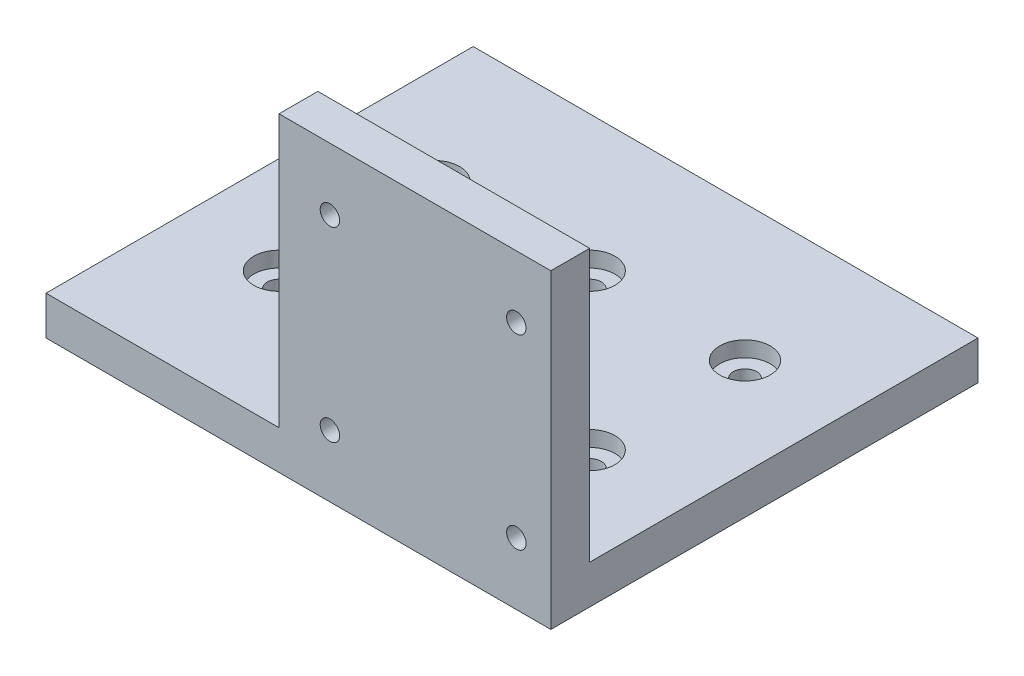
ISO-10303-21;
HEADER;
FILE_DESCRIPTION(('STEP AP214'),'2;1');
FILE_NAME('part.step','',(''),(''),'','','');
FILE_SCHEMA(('AUTOMOTIVE_DESIGN { 1 0 10303 214 1 1 1 1 }'));
ENDSEC;
DATA;
#1=APPLICATION_CONTEXT('core data for automotive mechanical design processes');
#2=APPLICATION_PROTOCOL_DEFINITION('international standard','automotive_design',2000,#1);
#3=PRODUCT_CONTEXT('',#1,'mechanical');
#4=PRODUCT('Part','Part','',(#3));
#5=PRODUCT_RELATED_PRODUCT_CATEGORY('part','',(#4));
#6=PRODUCT_DEFINITION_FORMATION('','',#4);
#7=PRODUCT_DEFINITION_CONTEXT('part definition',#1,'design');
#8=PRODUCT_DEFINITION('design','',#6,#7);
#9=PRODUCT_DEFINITION_SHAPE('','',#8);
#10=(LENGTH_UNIT() NAMED_UNIT(*) SI_UNIT(.MILLI.,.METRE.));
#11=(NAMED_UNIT(*) PLANE_ANGLE_UNIT() SI_UNIT($,.RADIAN.));
#12=(NAMED_UNIT(*) SI_UNIT($,.STERADIAN.) SOLID_ANGLE_UNIT());
#13=UNCERTAINTY_MEASURE_WITH_UNIT(LENGTH_MEASURE(1.E-05),#10,'distance_accuracy_value','');
#14=(GEOMETRIC_REPRESENTATION_CONTEXT(3) GLOBAL_UNCERTAINTY_ASSIGNED_CONTEXT((#13)) GLOBAL_UNIT_ASSIGNED_CONTEXT((#10,
#11,#12)) REPRESENTATION_CONTEXT('',''));
#15=CARTESIAN_POINT('',(0.,0.,0.));
#16=DIRECTION('',(0.,0.,1.));
#17=DIRECTION('',(1.,0.,0.));
#18=AXIS2_PLACEMENT_3D('',#15,#16,#17);
#19=CARTESIAN_POINT('',(0.,0.,10.));
#20=DIRECTION('',(0.,1.,0.));
#21=DIRECTION('',(0.,0.,1.));
#22=AXIS2_PLACEMENT_3D('',#19,#20,#21);
#23=CYLINDRICAL_SURFACE('',#22,1.5);
#24=CARTESIAN_POINT('',(0.,0.,10.));
#25=DIRECTION('',(0.,1.,0.));
#26=DIRECTION('',(0.,0.,1.));
#27=AXIS2_PLACEMENT_3D('',#24,#25,#26);
#28=CIRCLE('',#27,1.5);
#29=CARTESIAN_POINT('',(0.,0.,11.5));
#30=VERTEX_POINT('',#29);
#31=EDGE_CURVE('E212',#30,#30,#28,.T.);
#32=ORIENTED_EDGE('',*,*,#31,.F.);
#33=EDGE_LOOP('',(#32));
#34=FACE_BOUND('',#33,.T.);
#35=CARTESIAN_POINT('',(0.,3.,10.));
#36=DIRECTION('',(0.,1.,0.));
#37=DIRECTION('',(0.,0.,1.));
#38=AXIS2_PLACEMENT_3D('',#35,#36,#37);
#39=CIRCLE('',#38,1.5);
#40=CARTESIAN_POINT('',(0.,3.,11.5));
#41=VERTEX_POINT('',#40);
#42=EDGE_CURVE('E211',#41,#41,#39,.F.);
#43=ORIENTED_EDGE('',*,*,#42,.F.);
#44=EDGE_LOOP('',(#43));
#45=FACE_BOUND('',#44,.T.);
#46=ADVANCED_FACE('F46',(#34,#45),#23,.F.);
#47=CARTESIAN_POINT('',(20.,0.,10.));
#48=DIRECTION('',(0.,1.,0.));
#49=DIRECTION('',(0.,0.,1.));
#50=AXIS2_PLACEMENT_3D('',#47,#48,#49);
#51=CYLINDRICAL_SURFACE('',#50,1.5);
#52=CARTESIAN_POINT('',(20.,0.,10.));
#53=DIRECTION('',(0.,1.,0.));
#54=DIRECTION('',(0.,0.,1.));
#55=AXIS2_PLACEMENT_3D('',#52,#53,#54);
#56=CIRCLE('',#55,1.5);
#57=CARTESIAN_POINT('',(20.,0.,11.5));
#58=VERTEX_POINT('',#57);
#59=EDGE_CURVE('E216',#58,#58,#56,.T.);
#60=ORIENTED_EDGE('',*,*,#59,.F.);
#61=EDGE_LOOP('',(#60));
#62=FACE_BOUND('',#61,.T.);
#63=CARTESIAN_POINT('',(20.,3.,10.));
#64=DIRECTION('',(0.,1.,0.));
#65=DIRECTION('',(0.,0.,1.));
#66=AXIS2_PLACEMENT_3D('',#63,#64,#65);
#67=CIRCLE('',#66,1.5);
#68=CARTESIAN_POINT('',(20.,3.,11.5));
#69=VERTEX_POINT('',#68);
#70=EDGE_CURVE('E280',#69,#69,#67,.F.);
#71=ORIENTED_EDGE('',*,*,#70,.F.);
#72=EDGE_LOOP('',(#71));
#73=FACE_BOUND('',#72,.T.);
#74=ADVANCED_FACE('F335',(#62,#73),#51,.F.);
#75=CARTESIAN_POINT('',(-20.,0.,10.));
#76=DIRECTION('',(0.,1.,0.));
#77=DIRECTION('',(0.,0.,1.));
#78=AXIS2_PLACEMENT_3D('',#75,#76,#77);
#79=CYLINDRICAL_SURFACE('',#78,1.5);
#80=CARTESIAN_POINT('',(-20.,0.,10.));
#81=DIRECTION('',(0.,1.,0.));
#82=DIRECTION('',(0.,0.,1.));
#83=AXIS2_PLACEMENT_3D('',#80,#81,#82);
#84=CIRCLE('',#83,1.5);
#85=CARTESIAN_POINT('',(-20.,0.,11.5));
#86=VERTEX_POINT('',#85);
#87=EDGE_CURVE('E226',#86,#86,#84,.T.);
#88=ORIENTED_EDGE('',*,*,#87,.F.);
#89=EDGE_LOOP('',(#88));
#90=FACE_BOUND('',#89,.T.);
#91=CARTESIAN_POINT('',(-20.,3.,10.));
#92=DIRECTION('',(0.,1.,0.));
#93=DIRECTION('',(0.,0.,1.));
#94=AXIS2_PLACEMENT_3D('',#91,#92,#93);
#95=CIRCLE('',#94,1.5);
#96=CARTESIAN_POINT('',(-20.,3.,11.5));
#97=VERTEX_POINT('',#96);
#98=EDGE_CURVE('E276',#97,#97,#95,.F.);
#99=ORIENTED_EDGE('',*,*,#98,.F.);
#100=EDGE_LOOP('',(#99));
#101=FACE_BOUND('',#100,.T.);
#102=ADVANCED_FACE('F341',(#90,#101),#79,.F.);
#103=CARTESIAN_POINT('',(20.,0.,-9.99999999999999));
#104=DIRECTION('',(0.,1.,0.));
#105=DIRECTION('',(0.,0.,1.));
#106=AXIS2_PLACEMENT_3D('',#103,#104,#105);
#107=CYLINDRICAL_SURFACE('',#106,1.5);
#108=CARTESIAN_POINT('',(20.,0.,-9.99999999999999));
#109=DIRECTION('',(0.,1.,0.));
#110=DIRECTION('',(0.,0.,1.));
#111=AXIS2_PLACEMENT_3D('',#108,#109,#110);
#112=CIRCLE('',#111,1.5);
#113=CARTESIAN_POINT('',(20.,0.,-8.49999999999999));
#114=VERTEX_POINT('',#113);
#115=EDGE_CURVE('E222',#114,#114,#112,.T.);
#116=ORIENTED_EDGE('',*,*,#115,.F.);
#117=EDGE_LOOP('',(#116));
#118=FACE_BOUND('',#117,.T.);
#119=CARTESIAN_POINT('',(20.,3.,-9.99999999999999));
#120=DIRECTION('',(0.,1.,0.));
#121=DIRECTION('',(0.,0.,1.));
#122=AXIS2_PLACEMENT_3D('',#119,#120,#121);
#123=CIRCLE('',#122,1.5);
#124=CARTESIAN_POINT('',(20.,3.,-8.49999999999999));
#125=VERTEX_POINT('',#124);
#126=EDGE_CURVE('E272',#125,#125,#123,.F.);
#127=ORIENTED_EDGE('',*,*,#126,.F.);
#128=EDGE_LOOP('',(#127));
#129=FACE_BOUND('',#128,.T.);
#130=ADVANCED_FACE('F354',(#118,#129),#107,.F.);
#131=CARTESIAN_POINT('',(0.,0.,-9.99999999999999));
#132=DIRECTION('',(0.,1.,0.));
#133=DIRECTION('',(0.,0.,1.));
#134=AXIS2_PLACEMENT_3D('',#131,#132,#133);
#135=CYLINDRICAL_SURFACE('',#134,1.5);
#136=CARTESIAN_POINT('',(0.,0.,-9.99999999999999));
#137=DIRECTION('',(0.,1.,0.));
#138=DIRECTION('',(0.,0.,1.));
#139=AXIS2_PLACEMENT_3D('',#136,#137,#138);
#140=CIRCLE('',#139,1.5);
#141=CARTESIAN_POINT('',(0.,0.,-8.49999999999999));
#142=VERTEX_POINT('',#141);
#143=EDGE_CURVE('E217',#142,#142,#140,.T.);
#144=ORIENTED_EDGE('',*,*,#143,.F.);
#145=EDGE_LOOP('',(#144));
#146=FACE_BOUND('',#145,.T.);
#147=CARTESIAN_POINT('',(0.,3.,-9.99999999999999));
#148=DIRECTION('',(0.,1.,0.));
#149=DIRECTION('',(0.,0.,1.));
#150=AXIS2_PLACEMENT_3D('',#147,#148,#149);
#151=CIRCLE('',#150,1.5);
#152=CARTESIAN_POINT('',(0.,3.,-8.49999999999999));
#153=VERTEX_POINT('',#152);
#154=EDGE_CURVE('E198',#153,#153,#151,.F.);
#155=ORIENTED_EDGE('',*,*,#154,.F.);
#156=EDGE_LOOP('',(#155));
#157=FACE_BOUND('',#156,.T.);
#158=ADVANCED_FACE('F350',(#146,#157),#135,.F.);
#159=CARTESIAN_POINT('',(-20.,0.,-10.));
#160=DIRECTION('',(0.,1.,0.));
#161=DIRECTION('',(0.,0.,1.));
#162=AXIS2_PLACEMENT_3D('',#159,#160,#161);
#163=CYLINDRICAL_SURFACE('',#162,1.5);
#164=CARTESIAN_POINT('',(-20.,0.,-10.));
#165=DIRECTION('',(0.,1.,0.));
#166=DIRECTION('',(0.,0.,1.));
#167=AXIS2_PLACEMENT_3D('',#164,#165,#166);
#168=CIRCLE('',#167,1.5);
#169=CARTESIAN_POINT('',(-20.,0.,-8.5));
#170=VERTEX_POINT('',#169);
#171=EDGE_CURVE('E221',#170,#170,#168,.T.);
#172=ORIENTED_EDGE('',*,*,#171,.F.);
#173=EDGE_LOOP('',(#172));
#174=FACE_BOUND('',#173,.T.);
#175=CARTESIAN_POINT('',(-20.,3.,-10.));
#176=DIRECTION('',(0.,1.,0.));
#177=DIRECTION('',(0.,0.,1.));
#178=AXIS2_PLACEMENT_3D('',#175,#176,#177);
#179=CIRCLE('',#178,1.5);
#180=CARTESIAN_POINT('',(-20.,3.,-8.5));
#181=VERTEX_POINT('',#180);
#182=EDGE_CURVE('E206',#181,#181,#179,.F.);
#183=ORIENTED_EDGE('',*,*,#182,.F.);
#184=EDGE_LOOP('',(#183));
#185=FACE_BOUND('',#184,.T.);
#186=ADVANCED_FACE('F353',(#174,#185),#163,.F.);
#187=CARTESIAN_POINT('',(32.5,5.,27.5));
#188=DIRECTION('',(-1.,0.,0.));
#189=DIRECTION('',(0.,0.,1.));
#190=AXIS2_PLACEMENT_3D('',#187,#188,#189);
#191=PLANE('',#190);
#192=DIRECTION('',(0.,0.,-1.));
#193=VECTOR('',#192,1.);
#194=CARTESIAN_POINT('',(32.5,0.,27.5));
#195=LINE('',#194,#193);
#196=CARTESIAN_POINT('',(32.5,0.,27.5));
#197=VERTEX_POINT('',#196);
#198=CARTESIAN_POINT('',(32.5,0.,-27.5));
#199=VERTEX_POINT('',#198);
#200=EDGE_CURVE('E236',#197,#199,#195,.T.);
#201=ORIENTED_EDGE('',*,*,#200,.T.);
#202=DIRECTION('',(0.,-1.,0.));
#203=VECTOR('',#202,1.);
#204=CARTESIAN_POINT('',(32.5,5.,-27.5));
#205=LINE('',#204,#203);
#206=CARTESIAN_POINT('',(32.5,5.,-27.5));
#207=VERTEX_POINT('',#206);
#208=EDGE_CURVE('E11',#207,#199,#205,.T.);
#209=ORIENTED_EDGE('',*,*,#208,.F.);
#210=DIRECTION('',(0.,0.,-1.));
#211=VECTOR('',#210,1.);
#212=CARTESIAN_POINT('',(32.5,5.,27.5));
#213=LINE('',#212,#211);
#214=CARTESIAN_POINT('',(32.5,5.,22.5));
#215=VERTEX_POINT('',#214);
#216=EDGE_CURVE('E98',#215,#207,#213,.T.);
#217=ORIENTED_EDGE('',*,*,#216,.F.);
#218=DIRECTION('',(0.,-1.,0.));
#219=VECTOR('',#218,1.);
#220=CARTESIAN_POINT('',(32.5,40.,22.5));
#221=LINE('',#220,#219);
#222=CARTESIAN_POINT('',(32.5,40.,22.5));
#223=VERTEX_POINT('',#222);
#224=EDGE_CURVE('E64',#223,#215,#221,.T.);
#225=ORIENTED_EDGE('',*,*,#224,.F.);
#226=DIRECTION('',(0.,0.,-1.));
#227=VECTOR('',#226,1.);
#228=CARTESIAN_POINT('',(32.5,40.,0.));
#229=LINE('',#228,#227);
#230=CARTESIAN_POINT('',(32.5,40.,27.5));
#231=VERTEX_POINT('',#230);
#232=EDGE_CURVE('E138',#231,#223,#229,.T.);
#233=ORIENTED_EDGE('',*,*,#232,.F.);
#234=DIRECTION('',(0.,-1.,0.));
#235=VECTOR('',#234,1.);
#236=CARTESIAN_POINT('',(32.5,5.,27.5));
#237=LINE('',#236,#235);
#238=EDGE_CURVE('E134',#231,#197,#237,.T.);
#239=ORIENTED_EDGE('',*,*,#238,.T.);
#240=EDGE_LOOP('',(#201,#209,#217,#225,#233,#239));
#241=FACE_BOUND('',#240,.T.);
#242=ADVANCED_FACE('F48',(#241),#191,.F.);
#243=CARTESIAN_POINT('',(-32.5,5.,-27.5));
#244=DIRECTION('',(0.,0.,1.));
#245=DIRECTION('',(1.,0.,0.));
#246=AXIS2_PLACEMENT_3D('',#243,#244,#245);
#247=PLANE('',#246);
#248=DIRECTION('',(-1.,0.,0.));
#249=VECTOR('',#248,1.);
#250=CARTESIAN_POINT('',(-32.5,0.,-27.5));
#251=LINE('',#250,#249);
#252=CARTESIAN_POINT('',(-32.5,0.,-27.5));
#253=VERTEX_POINT('',#252);
#254=EDGE_CURVE('E250',#199,#253,#251,.T.);
#255=ORIENTED_EDGE('',*,*,#254,.T.);
#256=DIRECTION('',(0.,-1.,0.));
#257=VECTOR('',#256,1.);
#258=CARTESIAN_POINT('',(-32.5,5.,-27.5));
#259=LINE('',#258,#257);
#260=CARTESIAN_POINT('',(-32.5,5.,-27.5));
#261=VERTEX_POINT('',#260);
#262=EDGE_CURVE('E56',#261,#253,#259,.T.);
#263=ORIENTED_EDGE('',*,*,#262,.F.);
#264=DIRECTION('',(-1.,0.,0.));
#265=VECTOR('',#264,1.);
#266=CARTESIAN_POINT('',(-32.5,5.,-27.5));
#267=LINE('',#266,#265);
#268=EDGE_CURVE('E239',#207,#261,#267,.T.);
#269=ORIENTED_EDGE('',*,*,#268,.F.);
#270=ORIENTED_EDGE('',*,*,#208,.T.);
#271=EDGE_LOOP('',(#255,#263,#269,#270));
#272=FACE_BOUND('',#271,.T.);
#273=ADVANCED_FACE('F323',(#272),#247,.F.);
#274=CARTESIAN_POINT('',(-32.5,5.,27.5));
#275=DIRECTION('',(1.,0.,0.));
#276=DIRECTION('',(0.,0.,-1.));
#277=AXIS2_PLACEMENT_3D('',#274,#275,#276);
#278=PLANE('',#277);
#279=DIRECTION('',(0.,0.,1.));
#280=VECTOR('',#279,1.);
#281=CARTESIAN_POINT('',(-32.5,0.,27.5));
#282=LINE('',#281,#280);
#283=CARTESIAN_POINT('',(-32.5,0.,27.5));
#284=VERTEX_POINT('',#283);
#285=EDGE_CURVE('E253',#253,#284,#282,.T.);
#286=ORIENTED_EDGE('',*,*,#285,.T.);
#287=DIRECTION('',(0.,-1.,0.));
#288=VECTOR('',#287,1.);
#289=CARTESIAN_POINT('',(-32.5,5.,27.5));
#290=LINE('',#289,#288);
#291=CARTESIAN_POINT('',(-32.5,5.,27.5));
#292=VERTEX_POINT('',#291);
#293=EDGE_CURVE('E260',#292,#284,#290,.T.);
#294=ORIENTED_EDGE('',*,*,#293,.F.);
#295=DIRECTION('',(0.,0.,1.));
#296=VECTOR('',#295,1.);
#297=CARTESIAN_POINT('',(-32.5,5.,27.5));
#298=LINE('',#297,#296);
#299=EDGE_CURVE('E73',#261,#292,#298,.T.);
#300=ORIENTED_EDGE('',*,*,#299,.F.);
#301=ORIENTED_EDGE('',*,*,#262,.T.);
#302=EDGE_LOOP('',(#286,#294,#300,#301));
#303=FACE_BOUND('',#302,.T.);
#304=ADVANCED_FACE('F325',(#303),#278,.F.);
#305=CARTESIAN_POINT('',(-32.5,5.,27.5));
#306=DIRECTION('',(0.,0.,-1.));
#307=DIRECTION('',(-1.,0.,0.));
#308=AXIS2_PLACEMENT_3D('',#305,#306,#307);
#309=PLANE('',#308);
#310=CARTESIAN_POINT('',(4.0553429013079,8.,27.5));
#311=DIRECTION('',(0.,0.,1.));
#312=DIRECTION('',(1.,0.,0.));
#313=AXIS2_PLACEMENT_3D('',#310,#311,#312);
#314=CIRCLE('',#313,1.25);
#315=CARTESIAN_POINT('',(5.3053429013079,8.,27.5));
#316=VERTEX_POINT('',#315);
#317=EDGE_CURVE('E720',#316,#316,#314,.T.);
#318=ORIENTED_EDGE('',*,*,#317,.F.);
#319=EDGE_LOOP('',(#318));
#320=FACE_BOUND('',#319,.T.);
#321=CARTESIAN_POINT('',(28.0553429013079,32.,27.5));
#322=DIRECTION('',(0.,0.,1.));
#323=DIRECTION('',(1.,0.,0.));
#324=AXIS2_PLACEMENT_3D('',#321,#322,#323);
#325=CIRCLE('',#324,1.25);
#326=CARTESIAN_POINT('',(29.3053429013079,32.,27.5));
#327=VERTEX_POINT('',#326);
#328=EDGE_CURVE('E717',#327,#327,#325,.T.);
#329=ORIENTED_EDGE('',*,*,#328,.F.);
#330=EDGE_LOOP('',(#329));
#331=FACE_BOUND('',#330,.T.);
#332=CARTESIAN_POINT('',(28.0553429013079,8.,27.5));
#333=DIRECTION('',(0.,0.,1.));
#334=DIRECTION('',(1.,0.,0.));
#335=AXIS2_PLACEMENT_3D('',#332,#333,#334);
#336=CIRCLE('',#335,1.25);
#337=CARTESIAN_POINT('',(29.3053429013079,8.,27.5));
#338=VERTEX_POINT('',#337);
#339=EDGE_CURVE('E721',#338,#338,#336,.T.);
#340=ORIENTED_EDGE('',*,*,#339,.F.);
#341=EDGE_LOOP('',(#340));
#342=FACE_BOUND('',#341,.T.);
#343=CARTESIAN_POINT('',(4.0553429013079,32.,27.5));
#344=DIRECTION('',(0.,0.,1.));
#345=DIRECTION('',(1.,0.,0.));
#346=AXIS2_PLACEMENT_3D('',#343,#344,#345);
#347=CIRCLE('',#346,1.25);
#348=CARTESIAN_POINT('',(5.3053429013079,32.,27.5));
#349=VERTEX_POINT('',#348);
#350=EDGE_CURVE('E148',#349,#349,#347,.T.);
#351=ORIENTED_EDGE('',*,*,#350,.F.);
#352=EDGE_LOOP('',(#351));
#353=FACE_BOUND('',#352,.T.);
#354=DIRECTION('',(1.,0.,0.));
#355=VECTOR('',#354,1.);
#356=CARTESIAN_POINT('',(-32.5,0.,27.5));
#357=LINE('',#356,#355);
#358=EDGE_CURVE('E94',#284,#197,#357,.T.);
#359=ORIENTED_EDGE('',*,*,#358,.T.);
#360=ORIENTED_EDGE('',*,*,#238,.F.);
#361=DIRECTION('',(1.,0.,0.));
#362=VECTOR('',#361,1.);
#363=CARTESIAN_POINT('',(0.,40.,27.5));
#364=LINE('',#363,#362);
#365=CARTESIAN_POINT('',(-2.5,40.,27.5));
#366=VERTEX_POINT('',#365);
#367=EDGE_CURVE('E132',#366,#231,#364,.T.);
#368=ORIENTED_EDGE('',*,*,#367,.F.);
#369=DIRECTION('',(0.,-1.,0.));
#370=VECTOR('',#369,1.);
#371=CARTESIAN_POINT('',(-2.5,40.,27.5));
#372=LINE('',#371,#370);
#373=CARTESIAN_POINT('',(-2.5,5.,27.5));
#374=VERTEX_POINT('',#373);
#375=EDGE_CURVE('E119',#366,#374,#372,.T.);
#376=ORIENTED_EDGE('',*,*,#375,.T.);
#377=DIRECTION('',(1.,0.,0.));
#378=VECTOR('',#377,1.);
#379=CARTESIAN_POINT('',(-32.5,5.,27.5));
#380=LINE('',#379,#378);
#381=EDGE_CURVE('E244',#292,#374,#380,.T.);
#382=ORIENTED_EDGE('',*,*,#381,.F.);
#383=ORIENTED_EDGE('',*,*,#293,.T.);
#384=EDGE_LOOP('',(#359,#360,#368,#376,#382,#383));
#385=FACE_BOUND('',#384,.T.);
#386=ADVANCED_FACE('F133',(#320,#331,#342,#353,#385),#309,.F.);
#387=CARTESIAN_POINT('',(0.,5.,0.));
#388=DIRECTION('',(0.,-1.,0.));
#389=DIRECTION('',(0.,0.,-1.));
#390=AXIS2_PLACEMENT_3D('',#387,#388,#389);
#391=PLANE('',#390);
#392=CARTESIAN_POINT('',(20.,5.,-10.));
#393=DIRECTION('',(0.,1.,0.));
#394=DIRECTION('',(0.,0.,1.));
#395=AXIS2_PLACEMENT_3D('',#392,#393,#394);
#396=CIRCLE('',#395,3.25);
#397=CARTESIAN_POINT('',(20.,5.,-6.75));
#398=VERTEX_POINT('',#397);
#399=EDGE_CURVE('E183',#398,#398,#396,.T.);
#400=ORIENTED_EDGE('',*,*,#399,.F.);
#401=EDGE_LOOP('',(#400));
#402=FACE_BOUND('',#401,.T.);
#403=CARTESIAN_POINT('',(-20.,5.,10.));
#404=DIRECTION('',(0.,1.,0.));
#405=DIRECTION('',(0.,0.,1.));
#406=AXIS2_PLACEMENT_3D('',#403,#404,#405);
#407=CIRCLE('',#406,3.25);
#408=CARTESIAN_POINT('',(-20.,5.,13.25));
#409=VERTEX_POINT('',#408);
#410=EDGE_CURVE('E166',#409,#409,#407,.T.);
#411=ORIENTED_EDGE('',*,*,#410,.F.);
#412=EDGE_LOOP('',(#411));
#413=FACE_BOUND('',#412,.T.);
#414=CARTESIAN_POINT('',(0.,5.,10.));
#415=DIRECTION('',(0.,1.,0.));
#416=DIRECTION('',(0.,0.,1.));
#417=AXIS2_PLACEMENT_3D('',#414,#415,#416);
#418=CIRCLE('',#417,3.25);
#419=CARTESIAN_POINT('',(0.,5.,13.25));
#420=VERTEX_POINT('',#419);
#421=EDGE_CURVE('E167',#420,#420,#418,.T.);
#422=ORIENTED_EDGE('',*,*,#421,.F.);
#423=EDGE_LOOP('',(#422));
#424=FACE_BOUND('',#423,.T.);
#425=CARTESIAN_POINT('',(20.,5.,10.));
#426=DIRECTION('',(0.,1.,0.));
#427=DIRECTION('',(0.,0.,1.));
#428=AXIS2_PLACEMENT_3D('',#425,#426,#427);
#429=CIRCLE('',#428,3.25);
#430=CARTESIAN_POINT('',(20.,5.,13.25));
#431=VERTEX_POINT('',#430);
#432=EDGE_CURVE('E129',#431,#431,#429,.T.);
#433=ORIENTED_EDGE('',*,*,#432,.F.);
#434=EDGE_LOOP('',(#433));
#435=FACE_BOUND('',#434,.T.);
#436=CARTESIAN_POINT('',(0.,5.,-10.));
#437=DIRECTION('',(0.,1.,0.));
#438=DIRECTION('',(0.,0.,1.));
#439=AXIS2_PLACEMENT_3D('',#436,#437,#438);
#440=CIRCLE('',#439,3.25);
#441=CARTESIAN_POINT('',(0.,5.,-6.75));
#442=VERTEX_POINT('',#441);
#443=EDGE_CURVE('E182',#442,#442,#440,.T.);
#444=ORIENTED_EDGE('',*,*,#443,.F.);
#445=EDGE_LOOP('',(#444));
#446=FACE_BOUND('',#445,.T.);
#447=CARTESIAN_POINT('',(-20.,5.,-10.));
#448=DIRECTION('',(0.,1.,0.));
#449=DIRECTION('',(0.,0.,1.));
#450=AXIS2_PLACEMENT_3D('',#447,#448,#449);
#451=CIRCLE('',#450,3.25);
#452=CARTESIAN_POINT('',(-20.,5.,-6.75));
#453=VERTEX_POINT('',#452);
#454=EDGE_CURVE('E207',#453,#453,#451,.T.);
#455=ORIENTED_EDGE('',*,*,#454,.F.);
#456=EDGE_LOOP('',(#455));
#457=FACE_BOUND('',#456,.T.);
#458=ORIENTED_EDGE('',*,*,#381,.T.);
#459=DIRECTION('',(0.,0.,-1.));
#460=VECTOR('',#459,1.);
#461=CARTESIAN_POINT('',(-2.5,5.,0.));
#462=LINE('',#461,#460);
#463=CARTESIAN_POINT('',(-2.5,5.,22.5));
#464=VERTEX_POINT('',#463);
#465=EDGE_CURVE('E126',#374,#464,#462,.T.);
#466=ORIENTED_EDGE('',*,*,#465,.T.);
#467=DIRECTION('',(1.,0.,0.));
#468=VECTOR('',#467,1.);
#469=CARTESIAN_POINT('',(0.,5.,22.5));
#470=LINE('',#469,#468);
#471=EDGE_CURVE('E143',#464,#215,#470,.T.);
#472=ORIENTED_EDGE('',*,*,#471,.T.);
#473=ORIENTED_EDGE('',*,*,#216,.T.);
#474=ORIENTED_EDGE('',*,*,#268,.T.);
#475=ORIENTED_EDGE('',*,*,#299,.T.);
#476=EDGE_LOOP('',(#458,#466,#472,#473,#474,#475));
#477=FACE_BOUND('',#476,.T.);
#478=ADVANCED_FACE('F314',(#402,#413,#424,#435,#446,#457,#477),#391,.F.);
#479=CARTESIAN_POINT('',(0.,0.,0.));
#480=DIRECTION('',(0.,-1.,0.));
#481=DIRECTION('',(0.,0.,-1.));
#482=AXIS2_PLACEMENT_3D('',#479,#480,#481);
#483=PLANE('',#482);
#484=ORIENTED_EDGE('',*,*,#143,.T.);
#485=EDGE_LOOP('',(#484));
#486=FACE_BOUND('',#485,.T.);
#487=ORIENTED_EDGE('',*,*,#115,.T.);
#488=EDGE_LOOP('',(#487));
#489=FACE_BOUND('',#488,.T.);
#490=ORIENTED_EDGE('',*,*,#87,.T.);
#491=EDGE_LOOP('',(#490));
#492=FACE_BOUND('',#491,.T.);
#493=ORIENTED_EDGE('',*,*,#59,.T.);
#494=EDGE_LOOP('',(#493));
#495=FACE_BOUND('',#494,.T.);
#496=ORIENTED_EDGE('',*,*,#31,.T.);
#497=EDGE_LOOP('',(#496));
#498=FACE_BOUND('',#497,.T.);
#499=ORIENTED_EDGE('',*,*,#171,.T.);
#500=EDGE_LOOP('',(#499));
#501=FACE_BOUND('',#500,.T.);
#502=ORIENTED_EDGE('',*,*,#200,.F.);
#503=ORIENTED_EDGE('',*,*,#358,.F.);
#504=ORIENTED_EDGE('',*,*,#285,.F.);
#505=ORIENTED_EDGE('',*,*,#254,.F.);
#506=EDGE_LOOP('',(#502,#503,#504,#505));
#507=FACE_BOUND('',#506,.T.);
#508=ADVANCED_FACE('F319',(#486,#489,#492,#495,#498,#501,#507),#483,.T.);
#509=CARTESIAN_POINT('',(-20.,3.,-10.));
#510=DIRECTION('',(0.,1.,0.));
#511=DIRECTION('',(0.,0.,1.));
#512=AXIS2_PLACEMENT_3D('',#509,#510,#511);
#513=PLANE('',#512);
#514=CARTESIAN_POINT('',(-20.,3.,-10.));
#515=DIRECTION('',(0.,1.,0.));
#516=DIRECTION('',(0.,0.,1.));
#517=AXIS2_PLACEMENT_3D('',#514,#515,#516);
#518=CIRCLE('',#517,3.25);
#519=CARTESIAN_POINT('',(-20.,3.,-6.75));
#520=VERTEX_POINT('',#519);
#521=EDGE_CURVE('E202',#520,#520,#518,.T.);
#522=ORIENTED_EDGE('',*,*,#521,.T.);
#523=EDGE_LOOP('',(#522));
#524=FACE_BOUND('',#523,.T.);
#525=ORIENTED_EDGE('',*,*,#182,.T.);
#526=EDGE_LOOP('',(#525));
#527=FACE_BOUND('',#526,.T.);
#528=ADVANCED_FACE('F369',(#524,#527),#513,.T.);
#529=CARTESIAN_POINT('',(-20.,3.,-10.));
#530=DIRECTION('',(0.,1.,0.));
#531=DIRECTION('',(0.,0.,1.));
#532=AXIS2_PLACEMENT_3D('',#529,#530,#531);
#533=CYLINDRICAL_SURFACE('',#532,3.25);
#534=ORIENTED_EDGE('',*,*,#521,.F.);
#535=EDGE_LOOP('',(#534));
#536=FACE_BOUND('',#535,.T.);
#537=ORIENTED_EDGE('',*,*,#454,.T.);
#538=EDGE_LOOP('',(#537));
#539=FACE_BOUND('',#538,.T.);
#540=ADVANCED_FACE('F348',(#536,#539),#533,.F.);
#541=CARTESIAN_POINT('',(0.,3.,-10.));
#542=DIRECTION('',(0.,1.,0.));
#543=DIRECTION('',(0.,0.,1.));
#544=AXIS2_PLACEMENT_3D('',#541,#542,#543);
#545=PLANE('',#544);
#546=CARTESIAN_POINT('',(0.,3.,-10.));
#547=DIRECTION('',(0.,1.,0.));
#548=DIRECTION('',(0.,0.,1.));
#549=AXIS2_PLACEMENT_3D('',#546,#547,#548);
#550=CIRCLE('',#549,3.25);
#551=CARTESIAN_POINT('',(0.,3.,-6.75));
#552=VERTEX_POINT('',#551);
#553=EDGE_CURVE('E194',#552,#552,#550,.T.);
#554=ORIENTED_EDGE('',*,*,#553,.T.);
#555=EDGE_LOOP('',(#554));
#556=FACE_BOUND('',#555,.T.);
#557=ORIENTED_EDGE('',*,*,#154,.T.);
#558=EDGE_LOOP('',(#557));
#559=FACE_BOUND('',#558,.T.);
#560=ADVANCED_FACE('F423',(#556,#559),#545,.T.);
#561=CARTESIAN_POINT('',(0.,3.,-10.));
#562=DIRECTION('',(0.,1.,0.));
#563=DIRECTION('',(0.,0.,1.));
#564=AXIS2_PLACEMENT_3D('',#561,#562,#563);
#565=CYLINDRICAL_SURFACE('',#564,3.25);
#566=ORIENTED_EDGE('',*,*,#553,.F.);
#567=EDGE_LOOP('',(#566));
#568=FACE_BOUND('',#567,.T.);
#569=ORIENTED_EDGE('',*,*,#443,.T.);
#570=EDGE_LOOP('',(#569));
#571=FACE_BOUND('',#570,.T.);
#572=ADVANCED_FACE('F415',(#568,#571),#565,.F.);
#573=CARTESIAN_POINT('',(20.,3.,-10.));
#574=DIRECTION('',(0.,1.,0.));
#575=DIRECTION('',(0.,0.,1.));
#576=AXIS2_PLACEMENT_3D('',#573,#574,#575);
#577=PLANE('',#576);
#578=CARTESIAN_POINT('',(20.,3.,-10.));
#579=DIRECTION('',(0.,1.,0.));
#580=DIRECTION('',(0.,0.,1.));
#581=AXIS2_PLACEMENT_3D('',#578,#579,#580);
#582=CIRCLE('',#581,3.25);
#583=CARTESIAN_POINT('',(20.,3.,-6.75));
#584=VERTEX_POINT('',#583);
#585=EDGE_CURVE('E178',#584,#584,#582,.T.);
#586=ORIENTED_EDGE('',*,*,#585,.T.);
#587=EDGE_LOOP('',(#586));
#588=FACE_BOUND('',#587,.T.);
#589=ORIENTED_EDGE('',*,*,#126,.T.);
#590=EDGE_LOOP('',(#589));
#591=FACE_BOUND('',#590,.T.);
#592=ADVANCED_FACE('F411',(#588,#591),#577,.T.);
#593=CARTESIAN_POINT('',(20.,3.,-10.));
#594=DIRECTION('',(0.,1.,0.));
#595=DIRECTION('',(0.,0.,1.));
#596=AXIS2_PLACEMENT_3D('',#593,#594,#595);
#597=CYLINDRICAL_SURFACE('',#596,3.25);
#598=ORIENTED_EDGE('',*,*,#585,.F.);
#599=EDGE_LOOP('',(#598));
#600=FACE_BOUND('',#599,.T.);
#601=ORIENTED_EDGE('',*,*,#399,.T.);
#602=EDGE_LOOP('',(#601));
#603=FACE_BOUND('',#602,.T.);
#604=ADVANCED_FACE('F414',(#600,#603),#597,.F.);
#605=CARTESIAN_POINT('',(-20.,3.,10.));
#606=DIRECTION('',(0.,1.,0.));
#607=DIRECTION('',(0.,0.,1.));
#608=AXIS2_PLACEMENT_3D('',#605,#606,#607);
#609=PLANE('',#608);
#610=CARTESIAN_POINT('',(-20.,3.,10.));
#611=DIRECTION('',(0.,1.,0.));
#612=DIRECTION('',(0.,0.,1.));
#613=AXIS2_PLACEMENT_3D('',#610,#611,#612);
#614=CIRCLE('',#613,3.25);
#615=CARTESIAN_POINT('',(-20.,3.,13.25));
#616=VERTEX_POINT('',#615);
#617=EDGE_CURVE('E187',#616,#616,#614,.T.);
#618=ORIENTED_EDGE('',*,*,#617,.T.);
#619=EDGE_LOOP('',(#618));
#620=FACE_BOUND('',#619,.T.);
#621=ORIENTED_EDGE('',*,*,#98,.T.);
#622=EDGE_LOOP('',(#621));
#623=FACE_BOUND('',#622,.T.);
#624=ADVANCED_FACE('F404',(#620,#623),#609,.T.);
#625=CARTESIAN_POINT('',(-20.,3.,10.));
#626=DIRECTION('',(0.,1.,0.));
#627=DIRECTION('',(0.,0.,1.));
#628=AXIS2_PLACEMENT_3D('',#625,#626,#627);
#629=CYLINDRICAL_SURFACE('',#628,3.25);
#630=ORIENTED_EDGE('',*,*,#617,.F.);
#631=EDGE_LOOP('',(#630));
#632=FACE_BOUND('',#631,.T.);
#633=ORIENTED_EDGE('',*,*,#410,.T.);
#634=EDGE_LOOP('',(#633));
#635=FACE_BOUND('',#634,.T.);
#636=ADVANCED_FACE('F394',(#632,#635),#629,.F.);
#637=CARTESIAN_POINT('',(20.,3.,10.));
#638=DIRECTION('',(0.,1.,0.));
#639=DIRECTION('',(0.,0.,1.));
#640=AXIS2_PLACEMENT_3D('',#637,#638,#639);
#641=PLANE('',#640);
#642=CARTESIAN_POINT('',(20.,3.,10.));
#643=DIRECTION('',(0.,1.,0.));
#644=DIRECTION('',(0.,0.,1.));
#645=AXIS2_PLACEMENT_3D('',#642,#643,#644);
#646=CIRCLE('',#645,3.25);
#647=CARTESIAN_POINT('',(20.,3.,13.25));
#648=VERTEX_POINT('',#647);
#649=EDGE_CURVE('E171',#648,#648,#646,.T.);
#650=ORIENTED_EDGE('',*,*,#649,.T.);
#651=EDGE_LOOP('',(#650));
#652=FACE_BOUND('',#651,.T.);
#653=ORIENTED_EDGE('',*,*,#70,.T.);
#654=EDGE_LOOP('',(#653));
#655=FACE_BOUND('',#654,.T.);
#656=ADVANCED_FACE('F391',(#652,#655),#641,.T.);
#657=CARTESIAN_POINT('',(20.,3.,10.));
#658=DIRECTION('',(0.,1.,0.));
#659=DIRECTION('',(0.,0.,1.));
#660=AXIS2_PLACEMENT_3D('',#657,#658,#659);
#661=CYLINDRICAL_SURFACE('',#660,3.25);
#662=ORIENTED_EDGE('',*,*,#649,.F.);
#663=EDGE_LOOP('',(#662));
#664=FACE_BOUND('',#663,.T.);
#665=ORIENTED_EDGE('',*,*,#432,.T.);
#666=EDGE_LOOP('',(#665));
#667=FACE_BOUND('',#666,.T.);
#668=ADVANCED_FACE('F393',(#664,#667),#661,.F.);
#669=CARTESIAN_POINT('',(0.,3.,10.));
#670=DIRECTION('',(0.,1.,0.));
#671=DIRECTION('',(0.,0.,1.));
#672=AXIS2_PLACEMENT_3D('',#669,#670,#671);
#673=PLANE('',#672);
#674=CARTESIAN_POINT('',(0.,3.,10.));
#675=DIRECTION('',(0.,1.,0.));
#676=DIRECTION('',(0.,0.,1.));
#677=AXIS2_PLACEMENT_3D('',#674,#675,#676);
#678=CIRCLE('',#677,3.25);
#679=CARTESIAN_POINT('',(0.,3.,13.25));
#680=VERTEX_POINT('',#679);
#681=EDGE_CURVE('E162',#680,#680,#678,.T.);
#682=ORIENTED_EDGE('',*,*,#681,.T.);
#683=EDGE_LOOP('',(#682));
#684=FACE_BOUND('',#683,.T.);
#685=ORIENTED_EDGE('',*,*,#42,.T.);
#686=EDGE_LOOP('',(#685));
#687=FACE_BOUND('',#686,.T.);
#688=ADVANCED_FACE('F401',(#684,#687),#673,.T.);
#689=CARTESIAN_POINT('',(0.,3.,10.));
#690=DIRECTION('',(0.,1.,0.));
#691=DIRECTION('',(0.,0.,1.));
#692=AXIS2_PLACEMENT_3D('',#689,#690,#691);
#693=CYLINDRICAL_SURFACE('',#692,3.25);
#694=ORIENTED_EDGE('',*,*,#681,.F.);
#695=EDGE_LOOP('',(#694));
#696=FACE_BOUND('',#695,.T.);
#697=ORIENTED_EDGE('',*,*,#421,.T.);
#698=EDGE_LOOP('',(#697));
#699=FACE_BOUND('',#698,.T.);
#700=ADVANCED_FACE('F408',(#696,#699),#693,.F.);
#701=CARTESIAN_POINT('',(-2.5,40.,0.));
#702=DIRECTION('',(-1.,0.,0.));
#703=DIRECTION('',(0.,0.,1.));
#704=AXIS2_PLACEMENT_3D('',#701,#702,#703);
#705=PLANE('',#704);
#706=ORIENTED_EDGE('',*,*,#465,.F.);
#707=ORIENTED_EDGE('',*,*,#375,.F.);
#708=DIRECTION('',(0.,0.,-1.));
#709=VECTOR('',#708,1.);
#710=CARTESIAN_POINT('',(-2.5,40.,0.));
#711=LINE('',#710,#709);
#712=CARTESIAN_POINT('',(-2.5,40.,22.5));
#713=VERTEX_POINT('',#712);
#714=EDGE_CURVE('E123',#366,#713,#711,.T.);
#715=ORIENTED_EDGE('',*,*,#714,.T.);
#716=DIRECTION('',(0.,-1.,0.));
#717=VECTOR('',#716,1.);
#718=CARTESIAN_POINT('',(-2.5,40.,22.5));
#719=LINE('',#718,#717);
#720=EDGE_CURVE('E155',#713,#464,#719,.T.);
#721=ORIENTED_EDGE('',*,*,#720,.T.);
#722=EDGE_LOOP('',(#706,#707,#715,#721));
#723=FACE_BOUND('',#722,.T.);
#724=ADVANCED_FACE('F121',(#723),#705,.T.);
#725=CARTESIAN_POINT('',(0.,40.,22.5));
#726=DIRECTION('',(0.,0.,-1.));
#727=DIRECTION('',(-1.,0.,0.));
#728=AXIS2_PLACEMENT_3D('',#725,#726,#727);
#729=PLANE('',#728);
#730=CARTESIAN_POINT('',(4.0553429013079,8.,22.5));
#731=DIRECTION('',(0.,0.,-1.));
#732=DIRECTION('',(-1.,0.,0.));
#733=AXIS2_PLACEMENT_3D('',#730,#731,#732);
#734=CIRCLE('',#733,1.25);
#735=CARTESIAN_POINT('',(2.8053429013079,8.,22.5));
#736=VERTEX_POINT('',#735);
#737=EDGE_CURVE('E50',#736,#736,#734,.T.);
#738=ORIENTED_EDGE('',*,*,#737,.F.);
#739=EDGE_LOOP('',(#738));
#740=FACE_BOUND('',#739,.T.);
#741=CARTESIAN_POINT('',(28.0553429013079,32.,22.5));
#742=DIRECTION('',(0.,0.,-1.));
#743=DIRECTION('',(-1.,0.,0.));
#744=AXIS2_PLACEMENT_3D('',#741,#742,#743);
#745=CIRCLE('',#744,1.25);
#746=CARTESIAN_POINT('',(26.8053429013079,32.,22.5));
#747=VERTEX_POINT('',#746);
#748=EDGE_CURVE('E294',#747,#747,#745,.T.);
#749=ORIENTED_EDGE('',*,*,#748,.F.);
#750=EDGE_LOOP('',(#749));
#751=FACE_BOUND('',#750,.T.);
#752=CARTESIAN_POINT('',(28.0553429013079,8.,22.5));
#753=DIRECTION('',(0.,0.,-1.));
#754=DIRECTION('',(-1.,0.,0.));
#755=AXIS2_PLACEMENT_3D('',#752,#753,#754);
#756=CIRCLE('',#755,1.25);
#757=CARTESIAN_POINT('',(26.8053429013079,8.,22.5));
#758=VERTEX_POINT('',#757);
#759=EDGE_CURVE('E291',#758,#758,#756,.T.);
#760=ORIENTED_EDGE('',*,*,#759,.F.);
#761=EDGE_LOOP('',(#760));
#762=FACE_BOUND('',#761,.T.);
#763=CARTESIAN_POINT('',(4.0553429013079,32.,22.5));
#764=DIRECTION('',(0.,0.,-1.));
#765=DIRECTION('',(-1.,0.,0.));
#766=AXIS2_PLACEMENT_3D('',#763,#764,#765);
#767=CIRCLE('',#766,1.25);
#768=CARTESIAN_POINT('',(2.8053429013079,32.,22.5));
#769=VERTEX_POINT('',#768);
#770=EDGE_CURVE('E287',#769,#769,#767,.T.);
#771=ORIENTED_EDGE('',*,*,#770,.F.);
#772=EDGE_LOOP('',(#771));
#773=FACE_BOUND('',#772,.T.);
#774=ORIENTED_EDGE('',*,*,#471,.F.);
#775=ORIENTED_EDGE('',*,*,#720,.F.);
#776=DIRECTION('',(1.,0.,0.));
#777=VECTOR('',#776,1.);
#778=CARTESIAN_POINT('',(0.,40.,22.5));
#779=LINE('',#778,#777);
#780=EDGE_CURVE('E141',#713,#223,#779,.T.);
#781=ORIENTED_EDGE('',*,*,#780,.T.);
#782=ORIENTED_EDGE('',*,*,#224,.T.);
#783=EDGE_LOOP('',(#774,#775,#781,#782));
#784=FACE_BOUND('',#783,.T.);
#785=ADVANCED_FACE('F306',(#740,#751,#762,#773,#784),#729,.T.);
#786=CARTESIAN_POINT('',(0.,40.,0.));
#787=DIRECTION('',(0.,1.,0.));
#788=DIRECTION('',(0.,0.,1.));
#789=AXIS2_PLACEMENT_3D('',#786,#787,#788);
#790=PLANE('',#789);
#791=ORIENTED_EDGE('',*,*,#714,.F.);
#792=ORIENTED_EDGE('',*,*,#367,.T.);
#793=ORIENTED_EDGE('',*,*,#232,.T.);
#794=ORIENTED_EDGE('',*,*,#780,.F.);
#795=EDGE_LOOP('',(#791,#792,#793,#794));
#796=FACE_BOUND('',#795,.T.);
#797=ADVANCED_FACE('F140',(#796),#790,.T.);
#798=CARTESIAN_POINT('',(4.0553429013079,32.,-7.50000000000001));
#799=DIRECTION('',(0.,0.,1.));
#800=DIRECTION('',(1.,0.,0.));
#801=AXIS2_PLACEMENT_3D('',#798,#799,#800);
#802=CYLINDRICAL_SURFACE('',#801,1.25);
#803=ORIENTED_EDGE('',*,*,#770,.T.);
#804=EDGE_LOOP('',(#803));
#805=FACE_BOUND('',#804,.T.);
#806=ORIENTED_EDGE('',*,*,#350,.T.);
#807=EDGE_LOOP('',(#806));
#808=FACE_BOUND('',#807,.T.);
#809=ADVANCED_FACE('F552',(#805,#808),#802,.F.);
#810=CARTESIAN_POINT('',(28.0553429013079,8.,-7.50000000000001));
#811=DIRECTION('',(0.,0.,1.));
#812=DIRECTION('',(1.,0.,0.));
#813=AXIS2_PLACEMENT_3D('',#810,#811,#812);
#814=CYLINDRICAL_SURFACE('',#813,1.25);
#815=ORIENTED_EDGE('',*,*,#759,.T.);
#816=EDGE_LOOP('',(#815));
#817=FACE_BOUND('',#816,.T.);
#818=ORIENTED_EDGE('',*,*,#339,.T.);
#819=EDGE_LOOP('',(#818));
#820=FACE_BOUND('',#819,.T.);
#821=ADVANCED_FACE('F573',(#817,#820),#814,.F.);
#822=CARTESIAN_POINT('',(28.0553429013079,32.,-7.50000000000001));
#823=DIRECTION('',(0.,0.,1.));
#824=DIRECTION('',(1.,0.,0.));
#825=AXIS2_PLACEMENT_3D('',#822,#823,#824);
#826=CYLINDRICAL_SURFACE('',#825,1.25);
#827=ORIENTED_EDGE('',*,*,#748,.T.);
#828=EDGE_LOOP('',(#827));
#829=FACE_BOUND('',#828,.T.);
#830=ORIENTED_EDGE('',*,*,#328,.T.);
#831=EDGE_LOOP('',(#830));
#832=FACE_BOUND('',#831,.T.);
#833=ADVANCED_FACE('F584',(#829,#832),#826,.F.);
#834=CARTESIAN_POINT('',(4.0553429013079,8.,-7.50000000000001));
#835=DIRECTION('',(0.,0.,1.));
#836=DIRECTION('',(1.,0.,0.));
#837=AXIS2_PLACEMENT_3D('',#834,#835,#836);
#838=CYLINDRICAL_SURFACE('',#837,1.25);
#839=ORIENTED_EDGE('',*,*,#737,.T.);
#840=EDGE_LOOP('',(#839));
#841=FACE_BOUND('',#840,.T.);
#842=ORIENTED_EDGE('',*,*,#317,.T.);
#843=EDGE_LOOP('',(#842));
#844=FACE_BOUND('',#843,.T.);
#845=ADVANCED_FACE('F303',(#841,#844),#838,.F.);
#846=CLOSED_SHELL('',(#46,#74,#102,#130,#158,#186,#242,#273,#304,#386,#478,#508,#528,#540,#560,
#572,#592,#604,#624,#636,#656,#668,#688,#700,#724,#785,#797,#809,#821,#833,#845));
#847=MANIFOLD_SOLID_BREP('B2',#846);
#848=ADVANCED_BREP_SHAPE_REPRESENTATION('',(#18,#847),#14);
#849=SHAPE_DEFINITION_REPRESENTATION(#9,#848);
ENDSEC;
END-ISO-10303-21;
